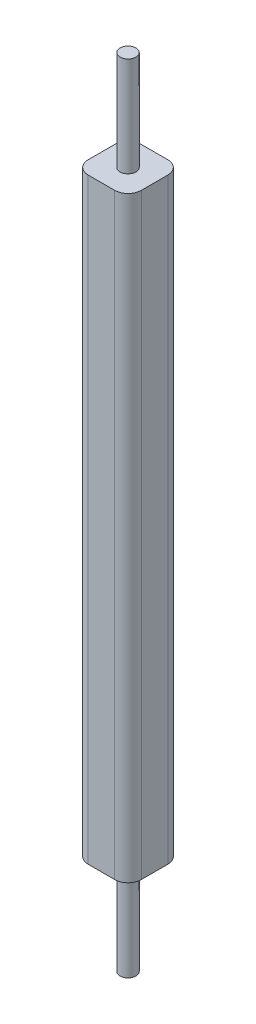
ISO-10303-21;
HEADER;
FILE_DESCRIPTION(('STEP AP214'),'2;1');
FILE_NAME('part.step','',(''),(''),'','','');
FILE_SCHEMA(('AUTOMOTIVE_DESIGN { 1 0 10303 214 1 1 1 1 }'));
ENDSEC;
DATA;
#1=APPLICATION_CONTEXT('core data for automotive mechanical design processes');
#2=APPLICATION_PROTOCOL_DEFINITION('international standard','automotive_design',2000,#1);
#3=PRODUCT_CONTEXT('',#1,'mechanical');
#4=PRODUCT('Part','Part','',(#3));
#5=PRODUCT_RELATED_PRODUCT_CATEGORY('part','',(#4));
#6=PRODUCT_DEFINITION_FORMATION('','',#4);
#7=PRODUCT_DEFINITION_CONTEXT('part definition',#1,'design');
#8=PRODUCT_DEFINITION('design','',#6,#7);
#9=PRODUCT_DEFINITION_SHAPE('','',#8);
#10=(LENGTH_UNIT() NAMED_UNIT(*) SI_UNIT(.MILLI.,.METRE.));
#11=(NAMED_UNIT(*) PLANE_ANGLE_UNIT() SI_UNIT($,.RADIAN.));
#12=(NAMED_UNIT(*) SI_UNIT($,.STERADIAN.) SOLID_ANGLE_UNIT());
#13=UNCERTAINTY_MEASURE_WITH_UNIT(LENGTH_MEASURE(1.E-05),#10,'distance_accuracy_value','');
#14=(GEOMETRIC_REPRESENTATION_CONTEXT(3) GLOBAL_UNCERTAINTY_ASSIGNED_CONTEXT((#13)) GLOBAL_UNIT_ASSIGNED_CONTEXT((#10,
#11,#12)) REPRESENTATION_CONTEXT('',''));
#15=CARTESIAN_POINT('',(0.,0.,0.));
#16=DIRECTION('',(0.,0.,1.));
#17=DIRECTION('',(1.,0.,0.));
#18=AXIS2_PLACEMENT_3D('',#15,#16,#17);
#19=CARTESIAN_POINT('',(0.,300.,0.));
#20=DIRECTION('',(0.,-1.,0.));
#21=DIRECTION('',(0.,0.,-1.));
#22=AXIS2_PLACEMENT_3D('',#19,#20,#21);
#23=CYLINDRICAL_SURFACE('',#22,6.);
#24=CARTESIAN_POINT('',(0.,225.,0.));
#25=DIRECTION('',(0.,1.,0.));
#26=DIRECTION('',(0.,0.,1.));
#27=AXIS2_PLACEMENT_3D('',#24,#25,#26);
#28=CIRCLE('',#27,6.);
#29=CARTESIAN_POINT('',(0.,225.,6.));
#30=VERTEX_POINT('',#29);
#31=EDGE_CURVE('E148',#30,#30,#28,.T.);
#32=ORIENTED_EDGE('',*,*,#31,.T.);
#33=EDGE_LOOP('',(#32));
#34=FACE_BOUND('',#33,.T.);
#35=CARTESIAN_POINT('',(0.,300.,0.));
#36=DIRECTION('',(0.,1.,0.));
#37=DIRECTION('',(0.,0.,1.));
#38=AXIS2_PLACEMENT_3D('',#35,#36,#37);
#39=CIRCLE('',#38,6.);
#40=CARTESIAN_POINT('',(0.,300.,6.));
#41=VERTEX_POINT('',#40);
#42=EDGE_CURVE('E141',#41,#41,#39,.T.);
#43=ORIENTED_EDGE('',*,*,#42,.F.);
#44=EDGE_LOOP('',(#43));
#45=FACE_BOUND('',#44,.T.);
#46=ADVANCED_FACE('F35',(#34,#45),#23,.T.);
#47=CARTESIAN_POINT('',(0.,300.,0.));
#48=DIRECTION('',(0.,1.,0.));
#49=DIRECTION('',(0.,0.,1.));
#50=AXIS2_PLACEMENT_3D('',#47,#48,#49);
#51=PLANE('',#50);
#52=ORIENTED_EDGE('',*,*,#42,.T.);
#53=EDGE_LOOP('',(#52));
#54=FACE_BOUND('',#53,.T.);
#55=ADVANCED_FACE('F202',(#54),#51,.T.);
#56=CARTESIAN_POINT('',(20.,225.,-20.));
#57=DIRECTION('',(-1.,0.,0.));
#58=DIRECTION('',(0.,0.,1.));
#59=AXIS2_PLACEMENT_3D('',#56,#57,#58);
#60=PLANE('',#59);
#61=DIRECTION('',(0.,0.,-1.));
#62=VECTOR('',#61,1.);
#63=CARTESIAN_POINT('',(20.,225.,-20.));
#64=LINE('',#63,#62);
#65=CARTESIAN_POINT('',(20.,225.,9.99999999999999));
#66=VERTEX_POINT('',#65);
#67=CARTESIAN_POINT('',(20.,225.,-10.));
#68=VERTEX_POINT('',#67);
#69=EDGE_CURVE('E122',#66,#68,#64,.T.);
#70=ORIENTED_EDGE('',*,*,#69,.F.);
#71=DIRECTION('',(0.,-1.,0.));
#72=VECTOR('',#71,1.);
#73=CARTESIAN_POINT('',(20.,225.,9.99999999999999));
#74=LINE('',#73,#72);
#75=CARTESIAN_POINT('',(20.,-225.,9.99999999999999));
#76=VERTEX_POINT('',#75);
#77=EDGE_CURVE('E106',#66,#76,#74,.T.);
#78=ORIENTED_EDGE('',*,*,#77,.T.);
#79=DIRECTION('',(0.,0.,-1.));
#80=VECTOR('',#79,1.);
#81=CARTESIAN_POINT('',(20.,-225.,-20.));
#82=LINE('',#81,#80);
#83=CARTESIAN_POINT('',(20.,-225.,-10.));
#84=VERTEX_POINT('',#83);
#85=EDGE_CURVE('E119',#76,#84,#82,.T.);
#86=ORIENTED_EDGE('',*,*,#85,.T.);
#87=DIRECTION('',(0.,-1.,0.));
#88=VECTOR('',#87,1.);
#89=CARTESIAN_POINT('',(20.,225.,-10.));
#90=LINE('',#89,#88);
#91=EDGE_CURVE('E124',#84,#68,#90,.F.);
#92=ORIENTED_EDGE('',*,*,#91,.T.);
#93=EDGE_LOOP('',(#70,#78,#86,#92));
#94=FACE_BOUND('',#93,.T.);
#95=ADVANCED_FACE('F118',(#94),#60,.F.);
#96=CARTESIAN_POINT('',(-20.,225.,-20.));
#97=DIRECTION('',(0.,0.,1.));
#98=DIRECTION('',(1.,0.,0.));
#99=AXIS2_PLACEMENT_3D('',#96,#97,#98);
#100=PLANE('',#99);
#101=DIRECTION('',(-1.,0.,0.));
#102=VECTOR('',#101,1.);
#103=CARTESIAN_POINT('',(-20.,225.,-20.));
#104=LINE('',#103,#102);
#105=CARTESIAN_POINT('',(9.99999999999999,225.,-20.));
#106=VERTEX_POINT('',#105);
#107=CARTESIAN_POINT('',(-10.,225.,-20.));
#108=VERTEX_POINT('',#107);
#109=EDGE_CURVE('E174',#106,#108,#104,.T.);
#110=ORIENTED_EDGE('',*,*,#109,.F.);
#111=DIRECTION('',(0.,-1.,0.));
#112=VECTOR('',#111,1.);
#113=CARTESIAN_POINT('',(9.99999999999999,225.,-20.));
#114=LINE('',#113,#112);
#115=CARTESIAN_POINT('',(9.99999999999999,-225.,-20.));
#116=VERTEX_POINT('',#115);
#117=EDGE_CURVE('E11',#106,#116,#114,.T.);
#118=ORIENTED_EDGE('',*,*,#117,.T.);
#119=DIRECTION('',(-1.,0.,0.));
#120=VECTOR('',#119,1.);
#121=CARTESIAN_POINT('',(-20.,-225.,-20.));
#122=LINE('',#121,#120);
#123=CARTESIAN_POINT('',(-10.,-225.,-20.));
#124=VERTEX_POINT('',#123);
#125=EDGE_CURVE('E129',#116,#124,#122,.T.);
#126=ORIENTED_EDGE('',*,*,#125,.T.);
#127=DIRECTION('',(0.,-1.,0.));
#128=VECTOR('',#127,1.);
#129=CARTESIAN_POINT('',(-10.,225.,-20.));
#130=LINE('',#129,#128);
#131=EDGE_CURVE('E43',#124,#108,#130,.F.);
#132=ORIENTED_EDGE('',*,*,#131,.T.);
#133=EDGE_LOOP('',(#110,#118,#126,#132));
#134=FACE_BOUND('',#133,.T.);
#135=ADVANCED_FACE('F173',(#134),#100,.F.);
#136=CARTESIAN_POINT('',(-20.,225.,-20.));
#137=DIRECTION('',(1.,0.,0.));
#138=DIRECTION('',(0.,0.,-1.));
#139=AXIS2_PLACEMENT_3D('',#136,#137,#138);
#140=PLANE('',#139);
#141=DIRECTION('',(0.,0.,1.));
#142=VECTOR('',#141,1.);
#143=CARTESIAN_POINT('',(-20.,-225.,-20.));
#144=LINE('',#143,#142);
#145=CARTESIAN_POINT('',(-20.,-225.,-10.));
#146=VERTEX_POINT('',#145);
#147=CARTESIAN_POINT('',(-20.,-225.,9.99999999999999));
#148=VERTEX_POINT('',#147);
#149=EDGE_CURVE('E132',#146,#148,#144,.T.);
#150=ORIENTED_EDGE('',*,*,#149,.T.);
#151=DIRECTION('',(0.,-1.,0.));
#152=VECTOR('',#151,1.);
#153=CARTESIAN_POINT('',(-20.,225.,9.99999999999999));
#154=LINE('',#153,#152);
#155=CARTESIAN_POINT('',(-20.,225.,9.99999999999999));
#156=VERTEX_POINT('',#155);
#157=EDGE_CURVE('E50',#148,#156,#154,.F.);
#158=ORIENTED_EDGE('',*,*,#157,.T.);
#159=DIRECTION('',(0.,0.,1.));
#160=VECTOR('',#159,1.);
#161=CARTESIAN_POINT('',(-20.,225.,-20.));
#162=LINE('',#161,#160);
#163=CARTESIAN_POINT('',(-20.,225.,-10.));
#164=VERTEX_POINT('',#163);
#165=EDGE_CURVE('E180',#164,#156,#162,.T.);
#166=ORIENTED_EDGE('',*,*,#165,.F.);
#167=DIRECTION('',(0.,-1.,0.));
#168=VECTOR('',#167,1.);
#169=CARTESIAN_POINT('',(-20.,225.,-10.));
#170=LINE('',#169,#168);
#171=EDGE_CURVE('E167',#164,#146,#170,.T.);
#172=ORIENTED_EDGE('',*,*,#171,.T.);
#173=EDGE_LOOP('',(#150,#158,#166,#172));
#174=FACE_BOUND('',#173,.T.);
#175=ADVANCED_FACE('F184',(#174),#140,.F.);
#176=CARTESIAN_POINT('',(-20.,225.,20.));
#177=DIRECTION('',(0.,0.,-1.));
#178=DIRECTION('',(-1.,0.,0.));
#179=AXIS2_PLACEMENT_3D('',#176,#177,#178);
#180=PLANE('',#179);
#181=DIRECTION('',(1.,0.,0.));
#182=VECTOR('',#181,1.);
#183=CARTESIAN_POINT('',(-20.,-225.,20.));
#184=LINE('',#183,#182);
#185=CARTESIAN_POINT('',(-10.,-225.,20.));
#186=VERTEX_POINT('',#185);
#187=CARTESIAN_POINT('',(10.,-225.,20.));
#188=VERTEX_POINT('',#187);
#189=EDGE_CURVE('E139',#186,#188,#184,.T.);
#190=ORIENTED_EDGE('',*,*,#189,.T.);
#191=DIRECTION('',(0.,-1.,0.));
#192=VECTOR('',#191,1.);
#193=CARTESIAN_POINT('',(10.,225.,20.));
#194=LINE('',#193,#192);
#195=CARTESIAN_POINT('',(10.,225.,20.));
#196=VERTEX_POINT('',#195);
#197=EDGE_CURVE('E107',#188,#196,#194,.F.);
#198=ORIENTED_EDGE('',*,*,#197,.T.);
#199=DIRECTION('',(1.,0.,0.));
#200=VECTOR('',#199,1.);
#201=CARTESIAN_POINT('',(-20.,225.,20.));
#202=LINE('',#201,#200);
#203=CARTESIAN_POINT('',(-10.,225.,20.));
#204=VERTEX_POINT('',#203);
#205=EDGE_CURVE('E135',#204,#196,#202,.T.);
#206=ORIENTED_EDGE('',*,*,#205,.F.);
#207=DIRECTION('',(0.,-1.,0.));
#208=VECTOR('',#207,1.);
#209=CARTESIAN_POINT('',(-10.,225.,20.));
#210=LINE('',#209,#208);
#211=EDGE_CURVE('E112',#204,#186,#210,.T.);
#212=ORIENTED_EDGE('',*,*,#211,.T.);
#213=EDGE_LOOP('',(#190,#198,#206,#212));
#214=FACE_BOUND('',#213,.T.);
#215=ADVANCED_FACE('F191',(#214),#180,.F.);
#216=CARTESIAN_POINT('',(0.,225.,0.));
#217=DIRECTION('',(0.,1.,0.));
#218=DIRECTION('',(0.,0.,1.));
#219=AXIS2_PLACEMENT_3D('',#216,#217,#218);
#220=PLANE('',#219);
#221=ORIENTED_EDGE('',*,*,#31,.F.);
#222=EDGE_LOOP('',(#221));
#223=FACE_BOUND('',#222,.T.);
#224=ORIENTED_EDGE('',*,*,#205,.T.);
#225=CARTESIAN_POINT('',(10.,225.,9.99999999999999));
#226=DIRECTION('',(0.,1.,0.));
#227=DIRECTION('',(0.,0.,1.));
#228=AXIS2_PLACEMENT_3D('',#225,#226,#227);
#229=CIRCLE('',#228,10.);
#230=EDGE_CURVE('E165',#196,#66,#229,.T.);
#231=ORIENTED_EDGE('',*,*,#230,.T.);
#232=ORIENTED_EDGE('',*,*,#69,.T.);
#233=CARTESIAN_POINT('',(9.99999999999999,225.,-10.));
#234=DIRECTION('',(0.,1.,0.));
#235=DIRECTION('',(0.,0.,1.));
#236=AXIS2_PLACEMENT_3D('',#233,#234,#235);
#237=CIRCLE('',#236,10.);
#238=EDGE_CURVE('E161',#68,#106,#237,.T.);
#239=ORIENTED_EDGE('',*,*,#238,.T.);
#240=ORIENTED_EDGE('',*,*,#109,.T.);
#241=CARTESIAN_POINT('',(-10.,225.,-10.));
#242=DIRECTION('',(0.,1.,0.));
#243=DIRECTION('',(0.,0.,1.));
#244=AXIS2_PLACEMENT_3D('',#241,#242,#243);
#245=CIRCLE('',#244,10.);
#246=EDGE_CURVE('E57',#108,#164,#245,.T.);
#247=ORIENTED_EDGE('',*,*,#246,.T.);
#248=ORIENTED_EDGE('',*,*,#165,.T.);
#249=CARTESIAN_POINT('',(-10.,225.,10.));
#250=DIRECTION('',(0.,1.,0.));
#251=DIRECTION('',(0.,0.,1.));
#252=AXIS2_PLACEMENT_3D('',#249,#250,#251);
#253=CIRCLE('',#252,10.);
#254=EDGE_CURVE('E163',#156,#204,#253,.T.);
#255=ORIENTED_EDGE('',*,*,#254,.T.);
#256=EDGE_LOOP('',(#224,#231,#232,#239,#240,#247,#248,#255));
#257=FACE_BOUND('',#256,.T.);
#258=ADVANCED_FACE('F178',(#223,#257),#220,.T.);
#259=CARTESIAN_POINT('',(0.,-225.,0.));
#260=DIRECTION('',(0.,1.,0.));
#261=DIRECTION('',(0.,0.,1.));
#262=AXIS2_PLACEMENT_3D('',#259,#260,#261);
#263=PLANE('',#262);
#264=CARTESIAN_POINT('',(0.,-225.,0.));
#265=DIRECTION('',(0.,1.,0.));
#266=DIRECTION('',(0.,0.,1.));
#267=AXIS2_PLACEMENT_3D('',#264,#265,#266);
#268=CIRCLE('',#267,6.);
#269=CARTESIAN_POINT('',(0.,-225.,6.));
#270=VERTEX_POINT('',#269);
#271=EDGE_CURVE('E144',#270,#270,#268,.T.);
#272=ORIENTED_EDGE('',*,*,#271,.T.);
#273=EDGE_LOOP('',(#272));
#274=FACE_BOUND('',#273,.T.);
#275=ORIENTED_EDGE('',*,*,#85,.F.);
#276=CARTESIAN_POINT('',(10.,-225.,9.99999999999999));
#277=DIRECTION('',(0.,1.,0.));
#278=DIRECTION('',(0.,0.,1.));
#279=AXIS2_PLACEMENT_3D('',#276,#277,#278);
#280=CIRCLE('',#279,10.);
#281=EDGE_CURVE('E102',#76,#188,#280,.F.);
#282=ORIENTED_EDGE('',*,*,#281,.T.);
#283=ORIENTED_EDGE('',*,*,#189,.F.);
#284=CARTESIAN_POINT('',(-10.,-225.,10.));
#285=DIRECTION('',(0.,1.,0.));
#286=DIRECTION('',(0.,0.,1.));
#287=AXIS2_PLACEMENT_3D('',#284,#285,#286);
#288=CIRCLE('',#287,10.);
#289=EDGE_CURVE('E113',#186,#148,#288,.F.);
#290=ORIENTED_EDGE('',*,*,#289,.T.);
#291=ORIENTED_EDGE('',*,*,#149,.F.);
#292=CARTESIAN_POINT('',(-10.,-225.,-10.));
#293=DIRECTION('',(0.,1.,0.));
#294=DIRECTION('',(0.,0.,1.));
#295=AXIS2_PLACEMENT_3D('',#292,#293,#294);
#296=CIRCLE('',#295,10.);
#297=EDGE_CURVE('E123',#146,#124,#296,.F.);
#298=ORIENTED_EDGE('',*,*,#297,.T.);
#299=ORIENTED_EDGE('',*,*,#125,.F.);
#300=CARTESIAN_POINT('',(9.99999999999999,-225.,-10.));
#301=DIRECTION('',(0.,1.,0.));
#302=DIRECTION('',(0.,0.,1.));
#303=AXIS2_PLACEMENT_3D('',#300,#301,#302);
#304=CIRCLE('',#303,10.);
#305=EDGE_CURVE('E128',#116,#84,#304,.F.);
#306=ORIENTED_EDGE('',*,*,#305,.T.);
#307=EDGE_LOOP('',(#275,#282,#283,#290,#291,#298,#299,#306));
#308=FACE_BOUND('',#307,.T.);
#309=ADVANCED_FACE('F126',(#274,#308),#263,.F.);
#310=CARTESIAN_POINT('',(0.,-300.,0.));
#311=DIRECTION('',(0.,1.,0.));
#312=DIRECTION('',(0.,0.,1.));
#313=AXIS2_PLACEMENT_3D('',#310,#311,#312);
#314=PLANE('',#313);
#315=CARTESIAN_POINT('',(0.,-300.,0.));
#316=DIRECTION('',(0.,1.,0.));
#317=DIRECTION('',(0.,0.,1.));
#318=AXIS2_PLACEMENT_3D('',#315,#316,#317);
#319=CIRCLE('',#318,6.);
#320=CARTESIAN_POINT('',(0.,-300.,6.));
#321=VERTEX_POINT('',#320);
#322=EDGE_CURVE('E145',#321,#321,#319,.T.);
#323=ORIENTED_EDGE('',*,*,#322,.F.);
#324=EDGE_LOOP('',(#323));
#325=FACE_BOUND('',#324,.T.);
#326=ADVANCED_FACE('F215',(#325),#314,.F.);
#327=ORIENTED_EDGE('',*,*,#322,.T.);
#328=EDGE_LOOP('',(#327));
#329=FACE_BOUND('',#328,.T.);
#330=ORIENTED_EDGE('',*,*,#271,.F.);
#331=EDGE_LOOP('',(#330));
#332=FACE_BOUND('',#331,.T.);
#333=ADVANCED_FACE('F205',(#329,#332),#23,.T.);
#334=CARTESIAN_POINT('',(10.,225.,9.99999999999999));
#335=DIRECTION('',(0.,-1.,0.));
#336=DIRECTION('',(0.,0.,-1.));
#337=AXIS2_PLACEMENT_3D('',#334,#335,#336);
#338=CYLINDRICAL_SURFACE('',#337,10.);
#339=ORIENTED_EDGE('',*,*,#230,.F.);
#340=ORIENTED_EDGE('',*,*,#197,.F.);
#341=ORIENTED_EDGE('',*,*,#281,.F.);
#342=ORIENTED_EDGE('',*,*,#77,.F.);
#343=EDGE_LOOP('',(#339,#340,#341,#342));
#344=FACE_BOUND('',#343,.T.);
#345=ADVANCED_FACE('F105',(#344),#338,.T.);
#346=CARTESIAN_POINT('',(-10.,225.,10.));
#347=DIRECTION('',(0.,-1.,0.));
#348=DIRECTION('',(0.,0.,-1.));
#349=AXIS2_PLACEMENT_3D('',#346,#347,#348);
#350=CYLINDRICAL_SURFACE('',#349,10.);
#351=ORIENTED_EDGE('',*,*,#254,.F.);
#352=ORIENTED_EDGE('',*,*,#157,.F.);
#353=ORIENTED_EDGE('',*,*,#289,.F.);
#354=ORIENTED_EDGE('',*,*,#211,.F.);
#355=EDGE_LOOP('',(#351,#352,#353,#354));
#356=FACE_BOUND('',#355,.T.);
#357=ADVANCED_FACE('F188',(#356),#350,.T.);
#358=CARTESIAN_POINT('',(9.99999999999999,225.,-10.));
#359=DIRECTION('',(0.,-1.,0.));
#360=DIRECTION('',(0.,0.,-1.));
#361=AXIS2_PLACEMENT_3D('',#358,#359,#360);
#362=CYLINDRICAL_SURFACE('',#361,10.);
#363=ORIENTED_EDGE('',*,*,#238,.F.);
#364=ORIENTED_EDGE('',*,*,#91,.F.);
#365=ORIENTED_EDGE('',*,*,#305,.F.);
#366=ORIENTED_EDGE('',*,*,#117,.F.);
#367=EDGE_LOOP('',(#363,#364,#365,#366));
#368=FACE_BOUND('',#367,.T.);
#369=ADVANCED_FACE('F194',(#368),#362,.T.);
#370=CARTESIAN_POINT('',(-10.,225.,-10.));
#371=DIRECTION('',(0.,-1.,0.));
#372=DIRECTION('',(0.,0.,-1.));
#373=AXIS2_PLACEMENT_3D('',#370,#371,#372);
#374=CYLINDRICAL_SURFACE('',#373,10.);
#375=ORIENTED_EDGE('',*,*,#246,.F.);
#376=ORIENTED_EDGE('',*,*,#131,.F.);
#377=ORIENTED_EDGE('',*,*,#297,.F.);
#378=ORIENTED_EDGE('',*,*,#171,.F.);
#379=EDGE_LOOP('',(#375,#376,#377,#378));
#380=FACE_BOUND('',#379,.T.);
#381=ADVANCED_FACE('F37',(#380),#374,.T.);
#382=CLOSED_SHELL('',(#46,#55,#95,#135,#175,#215,#258,#309,#326,#333,#345,#357,#369,#381));
#383=MANIFOLD_SOLID_BREP('B2',#382);
#384=ADVANCED_BREP_SHAPE_REPRESENTATION('',(#18,#383),#14);
#385=SHAPE_DEFINITION_REPRESENTATION(#9,#384);
ENDSEC;
END-ISO-10303-21;
